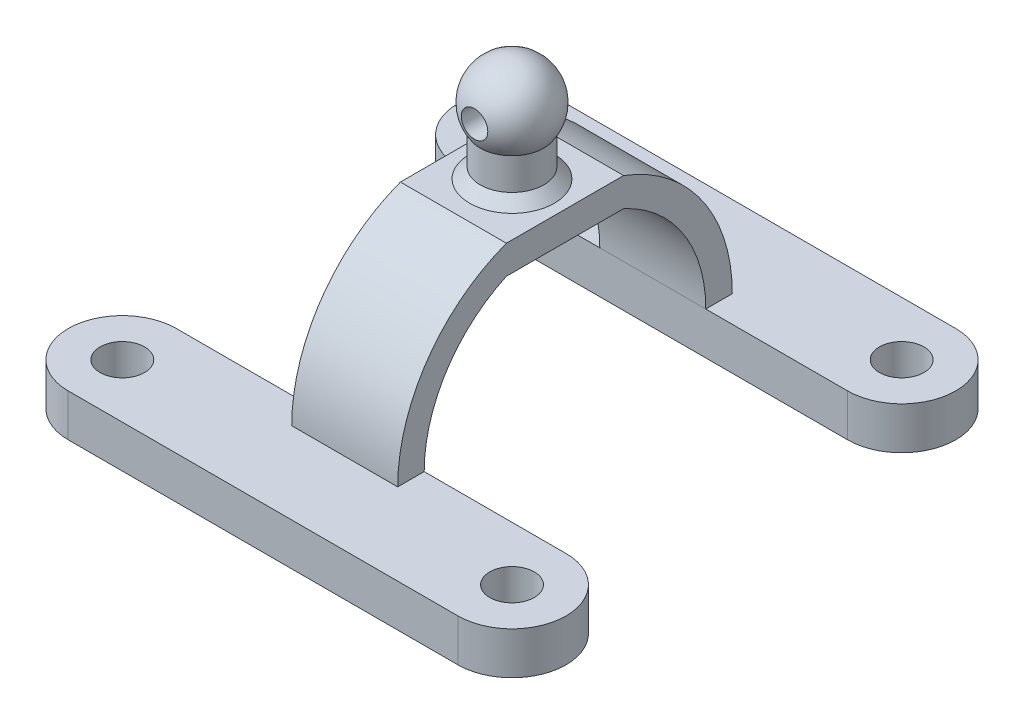
ISO-10303-21;
HEADER;
FILE_DESCRIPTION(('STEP AP214'),'2;1');
FILE_NAME('part.step','',(''),(''),'','','');
FILE_SCHEMA(('AUTOMOTIVE_DESIGN { 1 0 10303 214 1 1 1 1 }'));
ENDSEC;
DATA;
#1=APPLICATION_CONTEXT('core data for automotive mechanical design processes');
#2=APPLICATION_PROTOCOL_DEFINITION('international standard','automotive_design',2000,#1);
#3=PRODUCT_CONTEXT('',#1,'mechanical');
#4=PRODUCT('Part','Part','',(#3));
#5=PRODUCT_RELATED_PRODUCT_CATEGORY('part','',(#4));
#6=PRODUCT_DEFINITION_FORMATION('','',#4);
#7=PRODUCT_DEFINITION_CONTEXT('part definition',#1,'design');
#8=PRODUCT_DEFINITION('design','',#6,#7);
#9=PRODUCT_DEFINITION_SHAPE('','',#8);
#10=(LENGTH_UNIT() NAMED_UNIT(*) SI_UNIT(.MILLI.,.METRE.));
#11=(NAMED_UNIT(*) PLANE_ANGLE_UNIT() SI_UNIT($,.RADIAN.));
#12=(NAMED_UNIT(*) SI_UNIT($,.STERADIAN.) SOLID_ANGLE_UNIT());
#13=UNCERTAINTY_MEASURE_WITH_UNIT(LENGTH_MEASURE(1.E-05),#10,'distance_accuracy_value','');
#14=(GEOMETRIC_REPRESENTATION_CONTEXT(3) GLOBAL_UNCERTAINTY_ASSIGNED_CONTEXT((#13)) GLOBAL_UNIT_ASSIGNED_CONTEXT((#10,
#11,#12)) REPRESENTATION_CONTEXT('',''));
#15=CARTESIAN_POINT('',(0.,0.,0.));
#16=DIRECTION('',(0.,0.,1.));
#17=DIRECTION('',(1.,0.,0.));
#18=AXIS2_PLACEMENT_3D('',#15,#16,#17);
#19=CARTESIAN_POINT('',(-18.385,16.995,-18.385));
#20=DIRECTION('',(0.,1.,0.));
#21=DIRECTION('',(0.,0.,1.));
#22=AXIS2_PLACEMENT_3D('',#19,#20,#21);
#23=PLANE('',#22);
#24=CARTESIAN_POINT('',(-18.385,16.995,-18.385));
#25=DIRECTION('',(0.,1.,0.));
#26=DIRECTION('',(0.,0.,1.));
#27=AXIS2_PLACEMENT_3D('',#24,#25,#26);
#28=CIRCLE('',#27,3.6);
#29=CARTESIAN_POINT('',(-18.385,16.995,-14.785));
#30=VERTEX_POINT('',#29);
#31=EDGE_CURVE('E413',#30,#30,#28,.T.);
#32=ORIENTED_EDGE('',*,*,#31,.F.);
#33=EDGE_LOOP('',(#32));
#34=FACE_BOUND('',#33,.T.);
#35=CARTESIAN_POINT('',(-18.385,16.995,-18.385));
#36=DIRECTION('',(0.,1.,0.));
#37=DIRECTION('',(0.,0.,1.));
#38=AXIS2_PLACEMENT_3D('',#35,#36,#37);
#39=CIRCLE('',#38,2.1);
#40=CARTESIAN_POINT('',(-18.385,16.995,-16.285));
#41=VERTEX_POINT('',#40);
#42=EDGE_CURVE('E399',#41,#41,#39,.T.);
#43=ORIENTED_EDGE('',*,*,#42,.T.);
#44=EDGE_LOOP('',(#43));
#45=FACE_BOUND('',#44,.T.);
#46=ADVANCED_FACE('F49',(#34,#45),#23,.F.);
#47=CARTESIAN_POINT('',(-18.385,17.995,-18.385));
#48=DIRECTION('',(0.,-1.,0.));
#49=DIRECTION('',(0.,0.,-1.));
#50=AXIS2_PLACEMENT_3D('',#47,#48,#49);
#51=CYLINDRICAL_SURFACE('',#50,3.6);
#52=CARTESIAN_POINT('',(-18.385,17.995,-18.385));
#53=DIRECTION('',(0.,1.,0.));
#54=DIRECTION('',(0.,0.,1.));
#55=AXIS2_PLACEMENT_3D('',#52,#53,#54);
#56=CIRCLE('',#55,3.6);
#57=CARTESIAN_POINT('',(-18.385,17.995,-14.785));
#58=VERTEX_POINT('',#57);
#59=EDGE_CURVE('E414',#58,#58,#56,.T.);
#60=ORIENTED_EDGE('',*,*,#59,.F.);
#61=EDGE_LOOP('',(#60));
#62=FACE_BOUND('',#61,.T.);
#63=ORIENTED_EDGE('',*,*,#31,.T.);
#64=EDGE_LOOP('',(#63));
#65=FACE_BOUND('',#64,.T.);
#66=ADVANCED_FACE('F510',(#62,#65),#51,.T.);
#67=CARTESIAN_POINT('',(-18.385,17.995,-18.385));
#68=DIRECTION('',(0.,-1.,0.));
#69=DIRECTION('',(0.,0.,-1.));
#70=AXIS2_PLACEMENT_3D('',#67,#68,#69);
#71=CYLINDRICAL_SURFACE('',#70,2.1);
#72=CARTESIAN_POINT('',(-18.385,21.995,-18.385));
#73=DIRECTION('',(0.,1.,0.));
#74=DIRECTION('',(0.,0.,1.));
#75=AXIS2_PLACEMENT_3D('',#72,#73,#74);
#76=CIRCLE('',#75,2.1);
#77=CARTESIAN_POINT('',(-18.385,21.995,-16.285));
#78=VERTEX_POINT('',#77);
#79=EDGE_CURVE('E377',#78,#78,#76,.T.);
#80=ORIENTED_EDGE('',*,*,#79,.T.);
#81=EDGE_LOOP('',(#80));
#82=FACE_BOUND('',#81,.T.);
#83=ORIENTED_EDGE('',*,*,#42,.F.);
#84=EDGE_LOOP('',(#83));
#85=FACE_BOUND('',#84,.T.);
#86=ADVANCED_FACE('F504',(#82,#85),#71,.F.);
#87=CARTESIAN_POINT('',(0.,17.995,0.));
#88=DIRECTION('',(0.,1.,0.));
#89=DIRECTION('',(0.,0.,1.));
#90=AXIS2_PLACEMENT_3D('',#87,#88,#89);
#91=PLANE('',#90);
#92=DIRECTION('',(1.,0.,0.));
#93=VECTOR('',#92,1.);
#94=CARTESIAN_POINT('',(0.,17.995,-13.285));
#95=LINE('',#94,#93);
#96=CARTESIAN_POINT('',(-18.385,17.995,-13.285));
#97=VERTEX_POINT('',#96);
#98=CARTESIAN_POINT('',(18.385,17.995,-13.285));
#99=VERTEX_POINT('',#98);
#100=EDGE_CURVE('E97',#97,#99,#95,.T.);
#101=ORIENTED_EDGE('',*,*,#100,.F.);
#102=CARTESIAN_POINT('',(-18.385,17.995,-18.385));
#103=DIRECTION('',(0.,1.,0.));
#104=DIRECTION('',(0.,0.,1.));
#105=AXIS2_PLACEMENT_3D('',#102,#103,#104);
#106=CIRCLE('',#105,5.1);
#107=CARTESIAN_POINT('',(-18.385,17.995,-23.485));
#108=VERTEX_POINT('',#107);
#109=EDGE_CURVE('E348',#108,#97,#106,.T.);
#110=ORIENTED_EDGE('',*,*,#109,.F.);
#111=DIRECTION('',(1.,0.,0.));
#112=VECTOR('',#111,1.);
#113=CARTESIAN_POINT('',(0.,17.995,-23.485));
#114=LINE('',#113,#112);
#115=CARTESIAN_POINT('',(18.385,17.995,-23.485));
#116=VERTEX_POINT('',#115);
#117=EDGE_CURVE('E77',#108,#116,#114,.T.);
#118=ORIENTED_EDGE('',*,*,#117,.T.);
#119=CARTESIAN_POINT('',(18.385,17.995,-18.385));
#120=DIRECTION('',(0.,1.,0.));
#121=DIRECTION('',(0.,0.,1.));
#122=AXIS2_PLACEMENT_3D('',#119,#120,#121);
#123=CIRCLE('',#122,5.1);
#124=EDGE_CURVE('E353',#99,#116,#123,.T.);
#125=ORIENTED_EDGE('',*,*,#124,.F.);
#126=EDGE_LOOP('',(#101,#110,#118,#125));
#127=FACE_BOUND('',#126,.T.);
#128=CARTESIAN_POINT('',(18.385,17.995,-18.385));
#129=DIRECTION('',(0.,1.,0.));
#130=DIRECTION('',(0.,0.,1.));
#131=AXIS2_PLACEMENT_3D('',#128,#129,#130);
#132=CIRCLE('',#131,3.6);
#133=CARTESIAN_POINT('',(18.385,17.995,-14.785));
#134=VERTEX_POINT('',#133);
#135=EDGE_CURVE('E373',#134,#134,#132,.T.);
#136=ORIENTED_EDGE('',*,*,#135,.T.);
#137=EDGE_LOOP('',(#136));
#138=FACE_BOUND('',#137,.T.);
#139=ORIENTED_EDGE('',*,*,#59,.T.);
#140=EDGE_LOOP('',(#139));
#141=FACE_BOUND('',#140,.T.);
#142=ADVANCED_FACE('F501',(#127,#138,#141),#91,.F.);
#143=CARTESIAN_POINT('',(0.,17.995,-23.485));
#144=DIRECTION('',(0.,0.,1.));
#145=DIRECTION('',(0.,-1.,0.));
#146=AXIS2_PLACEMENT_3D('',#143,#144,#145);
#147=PLANE('',#146);
#148=DIRECTION('',(1.,0.,0.));
#149=VECTOR('',#148,1.);
#150=CARTESIAN_POINT('',(0.,21.995,-23.485));
#151=LINE('',#150,#149);
#152=CARTESIAN_POINT('',(-18.385,21.995,-23.485));
#153=VERTEX_POINT('',#152);
#154=CARTESIAN_POINT('',(18.385,21.995,-23.485));
#155=VERTEX_POINT('',#154);
#156=EDGE_CURVE('E383',#153,#155,#151,.T.);
#157=ORIENTED_EDGE('',*,*,#156,.T.);
#158=DIRECTION('',(0.,1.,0.));
#159=VECTOR('',#158,1.);
#160=CARTESIAN_POINT('',(18.385,17.995,-23.485));
#161=LINE('',#160,#159);
#162=EDGE_CURVE('E400',#116,#155,#161,.T.);
#163=ORIENTED_EDGE('',*,*,#162,.F.);
#164=ORIENTED_EDGE('',*,*,#117,.F.);
#165=DIRECTION('',(0.,1.,0.));
#166=VECTOR('',#165,1.);
#167=CARTESIAN_POINT('',(-18.385,17.995,-23.485));
#168=LINE('',#167,#166);
#169=EDGE_CURVE('E90',#108,#153,#168,.T.);
#170=ORIENTED_EDGE('',*,*,#169,.T.);
#171=EDGE_LOOP('',(#157,#163,#164,#170));
#172=FACE_BOUND('',#171,.T.);
#173=ADVANCED_FACE('F495',(#172),#147,.F.);
#174=CARTESIAN_POINT('',(0.,17.995,-13.285));
#175=DIRECTION('',(0.,0.,1.));
#176=DIRECTION('',(0.,-1.,0.));
#177=AXIS2_PLACEMENT_3D('',#174,#175,#176);
#178=PLANE('',#177);
#179=DIRECTION('',(1.,0.,0.));
#180=VECTOR('',#179,1.);
#181=CARTESIAN_POINT('',(0.,21.995,-13.285));
#182=LINE('',#181,#180);
#183=CARTESIAN_POINT('',(-18.385,21.995,-13.285));
#184=VERTEX_POINT('',#183);
#185=CARTESIAN_POINT('',(-5.,21.995,-13.285));
#186=VERTEX_POINT('',#185);
#187=EDGE_CURVE('E391',#184,#186,#182,.T.);
#188=ORIENTED_EDGE('',*,*,#187,.F.);
#189=DIRECTION('',(0.,1.,0.));
#190=VECTOR('',#189,1.);
#191=CARTESIAN_POINT('',(-18.385,17.995,-13.285));
#192=LINE('',#191,#190);
#193=EDGE_CURVE('E386',#97,#184,#192,.T.);
#194=ORIENTED_EDGE('',*,*,#193,.F.);
#195=ORIENTED_EDGE('',*,*,#100,.T.);
#196=DIRECTION('',(0.,1.,0.));
#197=VECTOR('',#196,1.);
#198=CARTESIAN_POINT('',(18.385,17.995,-13.285));
#199=LINE('',#198,#197);
#200=CARTESIAN_POINT('',(18.385,21.995,-13.285));
#201=VERTEX_POINT('',#200);
#202=EDGE_CURVE('E404',#99,#201,#199,.T.);
#203=ORIENTED_EDGE('',*,*,#202,.T.);
#204=CARTESIAN_POINT('',(5.,21.995,-13.285));
#205=VERTEX_POINT('',#204);
#206=EDGE_CURVE('E390',#205,#201,#182,.T.);
#207=ORIENTED_EDGE('',*,*,#206,.F.);
#208=DIRECTION('',(-1.,0.,0.));
#209=VECTOR('',#208,1.);
#210=CARTESIAN_POINT('',(5.,21.995,-13.285));
#211=LINE('',#210,#209);
#212=EDGE_CURVE('E329',#205,#186,#211,.T.);
#213=ORIENTED_EDGE('',*,*,#212,.T.);
#214=EDGE_LOOP('',(#188,#194,#195,#203,#207,#213));
#215=FACE_BOUND('',#214,.T.);
#216=ADVANCED_FACE('F468',(#215),#178,.T.);
#217=CARTESIAN_POINT('',(0.,21.995,0.));
#218=DIRECTION('',(0.,1.,0.));
#219=DIRECTION('',(0.,0.,1.));
#220=AXIS2_PLACEMENT_3D('',#217,#218,#219);
#221=PLANE('',#220);
#222=DIRECTION('',(0.,0.,1.));
#223=VECTOR('',#222,1.);
#224=CARTESIAN_POINT('',(5.,21.995,0.));
#225=LINE('',#224,#223);
#226=CARTESIAN_POINT('',(5.,21.995,-15.785));
#227=VERTEX_POINT('',#226);
#228=EDGE_CURVE('E285',#227,#205,#225,.T.);
#229=ORIENTED_EDGE('',*,*,#228,.T.);
#230=ORIENTED_EDGE('',*,*,#206,.T.);
#231=CARTESIAN_POINT('',(18.385,21.995,-18.385));
#232=DIRECTION('',(0.,1.,0.));
#233=DIRECTION('',(0.,0.,1.));
#234=AXIS2_PLACEMENT_3D('',#231,#232,#233);
#235=CIRCLE('',#234,5.1);
#236=EDGE_CURVE('E361',#201,#155,#235,.T.);
#237=ORIENTED_EDGE('',*,*,#236,.T.);
#238=ORIENTED_EDGE('',*,*,#156,.F.);
#239=CARTESIAN_POINT('',(-18.385,21.995,-18.385));
#240=DIRECTION('',(0.,1.,0.));
#241=DIRECTION('',(0.,0.,1.));
#242=AXIS2_PLACEMENT_3D('',#239,#240,#241);
#243=CIRCLE('',#242,5.1);
#244=EDGE_CURVE('E349',#153,#184,#243,.T.);
#245=ORIENTED_EDGE('',*,*,#244,.T.);
#246=ORIENTED_EDGE('',*,*,#187,.T.);
#247=DIRECTION('',(0.,0.,1.));
#248=VECTOR('',#247,1.);
#249=CARTESIAN_POINT('',(-5.,21.995,0.));
#250=LINE('',#249,#248);
#251=CARTESIAN_POINT('',(-5.,21.995,-15.785));
#252=VERTEX_POINT('',#251);
#253=EDGE_CURVE('E314',#252,#186,#250,.T.);
#254=ORIENTED_EDGE('',*,*,#253,.F.);
#255=DIRECTION('',(-1.,0.,0.));
#256=VECTOR('',#255,1.);
#257=CARTESIAN_POINT('',(5.,21.995,-15.785));
#258=LINE('',#257,#256);
#259=EDGE_CURVE('E326',#227,#252,#258,.T.);
#260=ORIENTED_EDGE('',*,*,#259,.F.);
#261=EDGE_LOOP('',(#229,#230,#237,#238,#245,#246,#254,#260));
#262=FACE_BOUND('',#261,.T.);
#263=ORIENTED_EDGE('',*,*,#79,.F.);
#264=EDGE_LOOP('',(#263));
#265=FACE_BOUND('',#264,.T.);
#266=CARTESIAN_POINT('',(18.385,21.995,-18.385));
#267=DIRECTION('',(0.,1.,0.));
#268=DIRECTION('',(0.,0.,1.));
#269=AXIS2_PLACEMENT_3D('',#266,#267,#268);
#270=CIRCLE('',#269,2.1);
#271=CARTESIAN_POINT('',(18.385,21.995,-16.285));
#272=VERTEX_POINT('',#271);
#273=EDGE_CURVE('E357',#272,#272,#270,.T.);
#274=ORIENTED_EDGE('',*,*,#273,.F.);
#275=EDGE_LOOP('',(#274));
#276=FACE_BOUND('',#275,.T.);
#277=ADVANCED_FACE('F462',(#262,#265,#276),#221,.T.);
#278=CARTESIAN_POINT('',(18.385,21.995,-18.385));
#279=DIRECTION('',(0.,-1.,0.));
#280=DIRECTION('',(0.,0.,-1.));
#281=AXIS2_PLACEMENT_3D('',#278,#279,#280);
#282=CYLINDRICAL_SURFACE('',#281,5.1);
#283=ORIENTED_EDGE('',*,*,#124,.T.);
#284=ORIENTED_EDGE('',*,*,#162,.T.);
#285=ORIENTED_EDGE('',*,*,#236,.F.);
#286=ORIENTED_EDGE('',*,*,#202,.F.);
#287=EDGE_LOOP('',(#283,#284,#285,#286));
#288=FACE_BOUND('',#287,.T.);
#289=ADVANCED_FACE('F494',(#288),#282,.T.);
#290=CARTESIAN_POINT('',(18.385,16.995,-18.385));
#291=DIRECTION('',(0.,1.,0.));
#292=DIRECTION('',(0.,0.,1.));
#293=AXIS2_PLACEMENT_3D('',#290,#291,#292);
#294=PLANE('',#293);
#295=CARTESIAN_POINT('',(18.385,16.995,-18.385));
#296=DIRECTION('',(0.,1.,0.));
#297=DIRECTION('',(0.,0.,1.));
#298=AXIS2_PLACEMENT_3D('',#295,#296,#297);
#299=CIRCLE('',#298,3.6);
#300=CARTESIAN_POINT('',(18.385,16.995,-14.785));
#301=VERTEX_POINT('',#300);
#302=EDGE_CURVE('E372',#301,#301,#299,.T.);
#303=ORIENTED_EDGE('',*,*,#302,.F.);
#304=EDGE_LOOP('',(#303));
#305=FACE_BOUND('',#304,.T.);
#306=CARTESIAN_POINT('',(18.385,16.995,-18.385));
#307=DIRECTION('',(0.,1.,0.));
#308=DIRECTION('',(0.,0.,1.));
#309=AXIS2_PLACEMENT_3D('',#306,#307,#308);
#310=CIRCLE('',#309,2.1);
#311=CARTESIAN_POINT('',(18.385,16.995,-16.285));
#312=VERTEX_POINT('',#311);
#313=EDGE_CURVE('E365',#312,#312,#310,.T.);
#314=ORIENTED_EDGE('',*,*,#313,.T.);
#315=EDGE_LOOP('',(#314));
#316=FACE_BOUND('',#315,.T.);
#317=ADVANCED_FACE('F536',(#305,#316),#294,.F.);
#318=CARTESIAN_POINT('',(18.385,17.995,-18.385));
#319=DIRECTION('',(0.,-1.,0.));
#320=DIRECTION('',(0.,0.,-1.));
#321=AXIS2_PLACEMENT_3D('',#318,#319,#320);
#322=CYLINDRICAL_SURFACE('',#321,3.6);
#323=ORIENTED_EDGE('',*,*,#135,.F.);
#324=EDGE_LOOP('',(#323));
#325=FACE_BOUND('',#324,.T.);
#326=ORIENTED_EDGE('',*,*,#302,.T.);
#327=EDGE_LOOP('',(#326));
#328=FACE_BOUND('',#327,.T.);
#329=ADVANCED_FACE('F532',(#325,#328),#322,.T.);
#330=CARTESIAN_POINT('',(18.385,17.995,-18.385));
#331=DIRECTION('',(0.,-1.,0.));
#332=DIRECTION('',(0.,0.,-1.));
#333=AXIS2_PLACEMENT_3D('',#330,#331,#332);
#334=CYLINDRICAL_SURFACE('',#333,2.1);
#335=ORIENTED_EDGE('',*,*,#313,.F.);
#336=EDGE_LOOP('',(#335));
#337=FACE_BOUND('',#336,.T.);
#338=ORIENTED_EDGE('',*,*,#273,.T.);
#339=EDGE_LOOP('',(#338));
#340=FACE_BOUND('',#339,.T.);
#341=ADVANCED_FACE('F535',(#337,#340),#334,.F.);
#342=CARTESIAN_POINT('',(-18.385,21.995,-18.385));
#343=DIRECTION('',(0.,-1.,0.));
#344=DIRECTION('',(0.,0.,-1.));
#345=AXIS2_PLACEMENT_3D('',#342,#343,#344);
#346=CYLINDRICAL_SURFACE('',#345,5.1);
#347=ORIENTED_EDGE('',*,*,#169,.F.);
#348=ORIENTED_EDGE('',*,*,#109,.T.);
#349=ORIENTED_EDGE('',*,*,#193,.T.);
#350=ORIENTED_EDGE('',*,*,#244,.F.);
#351=EDGE_LOOP('',(#347,#348,#349,#350));
#352=FACE_BOUND('',#351,.T.);
#353=ADVANCED_FACE('F498',(#352),#346,.T.);
#354=CARTESIAN_POINT('',(5.,21.995,0.));
#355=DIRECTION('',(-1.,0.,0.));
#356=DIRECTION('',(0.,0.,1.));
#357=AXIS2_PLACEMENT_3D('',#354,#355,#356);
#358=CYLINDRICAL_SURFACE('',#357,15.785);
#359=CARTESIAN_POINT('',(-5.,21.995,0.));
#360=DIRECTION('',(1.,0.,0.));
#361=DIRECTION('',(0.,0.,-1.));
#362=AXIS2_PLACEMENT_3D('',#359,#360,#361);
#363=CIRCLE('',#362,15.785);
#364=CARTESIAN_POINT('',(-5.,21.995,15.785));
#365=VERTEX_POINT('',#364);
#366=CARTESIAN_POINT('',(-5.,36.78,5.52901437871162));
#367=VERTEX_POINT('',#366);
#368=EDGE_CURVE('E264',#365,#367,#363,.F.);
#369=ORIENTED_EDGE('',*,*,#368,.F.);
#370=DIRECTION('',(-1.,0.,0.));
#371=VECTOR('',#370,1.);
#372=CARTESIAN_POINT('',(5.,21.995,15.785));
#373=LINE('',#372,#371);
#374=CARTESIAN_POINT('',(5.,21.995,15.785));
#375=VERTEX_POINT('',#374);
#376=EDGE_CURVE('E345',#375,#365,#373,.T.);
#377=ORIENTED_EDGE('',*,*,#376,.F.);
#378=CARTESIAN_POINT('',(5.,21.995,0.));
#379=DIRECTION('',(1.,0.,0.));
#380=DIRECTION('',(0.,0.,-1.));
#381=AXIS2_PLACEMENT_3D('',#378,#379,#380);
#382=CIRCLE('',#381,15.785);
#383=CARTESIAN_POINT('',(5.,36.78,5.52901437871162));
#384=VERTEX_POINT('',#383);
#385=EDGE_CURVE('E268',#375,#384,#382,.F.);
#386=ORIENTED_EDGE('',*,*,#385,.T.);
#387=DIRECTION('',(-1.,0.,0.));
#388=VECTOR('',#387,1.);
#389=CARTESIAN_POINT('',(5.,36.78,5.52901437871162));
#390=LINE('',#389,#388);
#391=EDGE_CURVE('E297',#384,#367,#390,.T.);
#392=ORIENTED_EDGE('',*,*,#391,.T.);
#393=EDGE_LOOP('',(#369,#377,#386,#392));
#394=FACE_BOUND('',#393,.T.);
#395=ADVANCED_FACE('F452',(#394),#358,.T.);
#396=CARTESIAN_POINT('',(5.,21.995,0.));
#397=DIRECTION('',(-1.,0.,0.));
#398=DIRECTION('',(0.,0.,1.));
#399=AXIS2_PLACEMENT_3D('',#396,#397,#398);
#400=CYLINDRICAL_SURFACE('',#399,13.285);
#401=CARTESIAN_POINT('',(-5.,21.995,0.));
#402=DIRECTION('',(1.,0.,0.));
#403=DIRECTION('',(0.,0.,-1.));
#404=AXIS2_PLACEMENT_3D('',#401,#402,#403);
#405=CIRCLE('',#404,13.285);
#406=CARTESIAN_POINT('',(-5.,21.995,13.285));
#407=VERTEX_POINT('',#406);
#408=CARTESIAN_POINT('',(-5.,34.0747858010811,5.52901437871162));
#409=VERTEX_POINT('',#408);
#410=EDGE_CURVE('E305',#407,#409,#405,.F.);
#411=ORIENTED_EDGE('',*,*,#410,.T.);
#412=DIRECTION('',(-1.,0.,0.));
#413=VECTOR('',#412,1.);
#414=CARTESIAN_POINT('',(5.,34.0747858010811,5.52901437871162));
#415=LINE('',#414,#413);
#416=CARTESIAN_POINT('',(5.,34.0747858010811,5.52901437871162));
#417=VERTEX_POINT('',#416);
#418=EDGE_CURVE('E337',#417,#409,#415,.T.);
#419=ORIENTED_EDGE('',*,*,#418,.F.);
#420=CARTESIAN_POINT('',(5.,21.995,0.));
#421=DIRECTION('',(1.,0.,0.));
#422=DIRECTION('',(0.,0.,-1.));
#423=AXIS2_PLACEMENT_3D('',#420,#421,#422);
#424=CIRCLE('',#423,13.285);
#425=CARTESIAN_POINT('',(5.,21.995,13.285));
#426=VERTEX_POINT('',#425);
#427=EDGE_CURVE('E276',#426,#417,#424,.F.);
#428=ORIENTED_EDGE('',*,*,#427,.F.);
#429=DIRECTION('',(-1.,0.,0.));
#430=VECTOR('',#429,1.);
#431=CARTESIAN_POINT('',(5.,21.995,13.285));
#432=LINE('',#431,#430);
#433=EDGE_CURVE('E341',#426,#407,#432,.T.);
#434=ORIENTED_EDGE('',*,*,#433,.T.);
#435=EDGE_LOOP('',(#411,#419,#428,#434));
#436=FACE_BOUND('',#435,.T.);
#437=ADVANCED_FACE('F478',(#436),#400,.F.);
#438=CARTESIAN_POINT('',(5.,34.0747858010811,0.));
#439=DIRECTION('',(0.,1.,0.));
#440=DIRECTION('',(0.,0.,1.));
#441=AXIS2_PLACEMENT_3D('',#438,#439,#440);
#442=PLANE('',#441);
#443=DIRECTION('',(0.,0.,-1.));
#444=VECTOR('',#443,1.);
#445=CARTESIAN_POINT('',(-5.,34.0747858010811,0.));
#446=LINE('',#445,#444);
#447=CARTESIAN_POINT('',(-5.,34.0747858010811,-5.52901437871162));
#448=VERTEX_POINT('',#447);
#449=EDGE_CURVE('E308',#409,#448,#446,.T.);
#450=ORIENTED_EDGE('',*,*,#449,.T.);
#451=DIRECTION('',(-1.,0.,0.));
#452=VECTOR('',#451,1.);
#453=CARTESIAN_POINT('',(5.,34.0747858010811,-5.52901437871162));
#454=LINE('',#453,#452);
#455=CARTESIAN_POINT('',(5.,34.0747858010811,-5.52901437871162));
#456=VERTEX_POINT('',#455);
#457=EDGE_CURVE('E333',#456,#448,#454,.T.);
#458=ORIENTED_EDGE('',*,*,#457,.F.);
#459=DIRECTION('',(0.,0.,-1.));
#460=VECTOR('',#459,1.);
#461=CARTESIAN_POINT('',(5.,34.0747858010811,0.));
#462=LINE('',#461,#460);
#463=EDGE_CURVE('E279',#417,#456,#462,.T.);
#464=ORIENTED_EDGE('',*,*,#463,.F.);
#465=ORIENTED_EDGE('',*,*,#418,.T.);
#466=EDGE_LOOP('',(#450,#458,#464,#465));
#467=FACE_BOUND('',#466,.T.);
#468=ADVANCED_FACE('F475',(#467),#442,.F.);
#469=CARTESIAN_POINT('',(5.,21.995,0.));
#470=DIRECTION('',(-1.,0.,0.));
#471=DIRECTION('',(0.,0.,1.));
#472=AXIS2_PLACEMENT_3D('',#469,#470,#471);
#473=CYLINDRICAL_SURFACE('',#472,13.285);
#474=CARTESIAN_POINT('',(-5.,21.995,0.));
#475=DIRECTION('',(1.,0.,0.));
#476=DIRECTION('',(0.,0.,-1.));
#477=AXIS2_PLACEMENT_3D('',#474,#475,#476);
#478=CIRCLE('',#477,13.285);
#479=EDGE_CURVE('E311',#448,#186,#478,.F.);
#480=ORIENTED_EDGE('',*,*,#479,.T.);
#481=ORIENTED_EDGE('',*,*,#212,.F.);
#482=CARTESIAN_POINT('',(5.,21.995,0.));
#483=DIRECTION('',(1.,0.,0.));
#484=DIRECTION('',(0.,0.,-1.));
#485=AXIS2_PLACEMENT_3D('',#482,#483,#484);
#486=CIRCLE('',#485,13.285);
#487=EDGE_CURVE('E282',#456,#205,#486,.F.);
#488=ORIENTED_EDGE('',*,*,#487,.F.);
#489=ORIENTED_EDGE('',*,*,#457,.T.);
#490=EDGE_LOOP('',(#480,#481,#488,#489));
#491=FACE_BOUND('',#490,.T.);
#492=ADVANCED_FACE('F471',(#491),#473,.F.);
#493=CARTESIAN_POINT('',(5.,21.995,0.));
#494=DIRECTION('',(-1.,0.,0.));
#495=DIRECTION('',(0.,0.,1.));
#496=AXIS2_PLACEMENT_3D('',#493,#494,#495);
#497=CYLINDRICAL_SURFACE('',#496,15.785);
#498=CARTESIAN_POINT('',(-5.,21.995,0.));
#499=DIRECTION('',(1.,0.,0.));
#500=DIRECTION('',(0.,0.,-1.));
#501=AXIS2_PLACEMENT_3D('',#498,#499,#500);
#502=CIRCLE('',#501,15.785);
#503=CARTESIAN_POINT('',(-5.,36.78,-5.52901437871162));
#504=VERTEX_POINT('',#503);
#505=EDGE_CURVE('E68',#504,#252,#502,.F.);
#506=ORIENTED_EDGE('',*,*,#505,.F.);
#507=DIRECTION('',(-1.,0.,0.));
#508=VECTOR('',#507,1.);
#509=CARTESIAN_POINT('',(5.,36.78,-5.52901437871162));
#510=LINE('',#509,#508);
#511=CARTESIAN_POINT('',(5.,36.78,-5.52901437871162));
#512=VERTEX_POINT('',#511);
#513=EDGE_CURVE('E323',#512,#504,#510,.T.);
#514=ORIENTED_EDGE('',*,*,#513,.F.);
#515=CARTESIAN_POINT('',(5.,21.995,0.));
#516=DIRECTION('',(1.,0.,0.));
#517=DIRECTION('',(0.,0.,-1.));
#518=AXIS2_PLACEMENT_3D('',#515,#516,#517);
#519=CIRCLE('',#518,15.785);
#520=EDGE_CURVE('E289',#512,#227,#519,.F.);
#521=ORIENTED_EDGE('',*,*,#520,.T.);
#522=ORIENTED_EDGE('',*,*,#259,.T.);
#523=EDGE_LOOP('',(#506,#514,#521,#522));
#524=FACE_BOUND('',#523,.T.);
#525=ADVANCED_FACE('F444',(#524),#497,.T.);
#526=CARTESIAN_POINT('',(5.,36.78,0.));
#527=DIRECTION('',(0.,1.,0.));
#528=DIRECTION('',(0.,0.,1.));
#529=AXIS2_PLACEMENT_3D('',#526,#527,#528);
#530=PLANE('',#529);
#531=CARTESIAN_POINT('',(0.,36.78,0.));
#532=DIRECTION('',(0.,1.,0.));
#533=DIRECTION('',(0.,0.,1.));
#534=AXIS2_PLACEMENT_3D('',#531,#532,#533);
#535=CIRCLE('',#534,4.);
#536=CARTESIAN_POINT('',(0.,36.78,4.));
#537=VERTEX_POINT('',#536);
#538=EDGE_CURVE('E60',#537,#537,#535,.T.);
#539=ORIENTED_EDGE('',*,*,#538,.F.);
#540=EDGE_LOOP('',(#539));
#541=FACE_BOUND('',#540,.T.);
#542=DIRECTION('',(0.,0.,-1.));
#543=VECTOR('',#542,1.);
#544=CARTESIAN_POINT('',(-5.,36.78,0.));
#545=LINE('',#544,#543);
#546=EDGE_CURVE('E273',#367,#504,#545,.T.);
#547=ORIENTED_EDGE('',*,*,#546,.F.);
#548=ORIENTED_EDGE('',*,*,#391,.F.);
#549=DIRECTION('',(0.,0.,-1.));
#550=VECTOR('',#549,1.);
#551=CARTESIAN_POINT('',(5.,36.78,0.));
#552=LINE('',#551,#550);
#553=EDGE_CURVE('E293',#384,#512,#552,.T.);
#554=ORIENTED_EDGE('',*,*,#553,.T.);
#555=ORIENTED_EDGE('',*,*,#513,.T.);
#556=EDGE_LOOP('',(#547,#548,#554,#555));
#557=FACE_BOUND('',#556,.T.);
#558=ADVANCED_FACE('F440',(#541,#557),#530,.T.);
#559=CARTESIAN_POINT('',(5.,0.,0.));
#560=DIRECTION('',(1.,0.,0.));
#561=DIRECTION('',(0.,0.,-1.));
#562=AXIS2_PLACEMENT_3D('',#559,#560,#561);
#563=PLANE('',#562);
#564=ORIENTED_EDGE('',*,*,#385,.F.);
#565=DIRECTION('',(0.,0.,1.));
#566=VECTOR('',#565,1.);
#567=CARTESIAN_POINT('',(5.,21.995,0.));
#568=LINE('',#567,#566);
#569=EDGE_CURVE('E272',#426,#375,#568,.T.);
#570=ORIENTED_EDGE('',*,*,#569,.F.);
#571=ORIENTED_EDGE('',*,*,#427,.T.);
#572=ORIENTED_EDGE('',*,*,#463,.T.);
#573=ORIENTED_EDGE('',*,*,#487,.T.);
#574=ORIENTED_EDGE('',*,*,#228,.F.);
#575=ORIENTED_EDGE('',*,*,#520,.F.);
#576=ORIENTED_EDGE('',*,*,#553,.F.);
#577=EDGE_LOOP('',(#564,#570,#571,#572,#573,#574,#575,#576));
#578=FACE_BOUND('',#577,.T.);
#579=ADVANCED_FACE('F443',(#578),#563,.T.);
#580=CARTESIAN_POINT('',(-5.,0.,0.));
#581=DIRECTION('',(1.,0.,0.));
#582=DIRECTION('',(0.,0.,-1.));
#583=AXIS2_PLACEMENT_3D('',#580,#581,#582);
#584=PLANE('',#583);
#585=ORIENTED_EDGE('',*,*,#368,.T.);
#586=ORIENTED_EDGE('',*,*,#546,.T.);
#587=ORIENTED_EDGE('',*,*,#505,.T.);
#588=ORIENTED_EDGE('',*,*,#253,.T.);
#589=ORIENTED_EDGE('',*,*,#479,.F.);
#590=ORIENTED_EDGE('',*,*,#449,.F.);
#591=ORIENTED_EDGE('',*,*,#410,.F.);
#592=DIRECTION('',(0.,0.,1.));
#593=VECTOR('',#592,1.);
#594=CARTESIAN_POINT('',(-5.,21.995,0.));
#595=LINE('',#594,#593);
#596=EDGE_CURVE('E301',#407,#365,#595,.T.);
#597=ORIENTED_EDGE('',*,*,#596,.T.);
#598=EDGE_LOOP('',(#585,#586,#587,#588,#589,#590,#591,#597));
#599=FACE_BOUND('',#598,.T.);
#600=ADVANCED_FACE('F447',(#599),#584,.F.);
#601=CARTESIAN_POINT('',(18.385,21.995,18.385));
#602=DIRECTION('',(0.,-1.,0.));
#603=DIRECTION('',(0.,0.,-1.));
#604=AXIS2_PLACEMENT_3D('',#601,#602,#603);
#605=CYLINDRICAL_SURFACE('',#604,5.1);
#606=DIRECTION('',(0.,1.,0.));
#607=VECTOR('',#606,1.);
#608=CARTESIAN_POINT('',(18.385,17.995,13.285));
#609=LINE('',#608,#607);
#610=CARTESIAN_POINT('',(18.385,17.995,13.285));
#611=VERTEX_POINT('',#610);
#612=CARTESIAN_POINT('',(18.385,21.995,13.285));
#613=VERTEX_POINT('',#612);
#614=EDGE_CURVE('E240',#611,#613,#609,.T.);
#615=ORIENTED_EDGE('',*,*,#614,.T.);
#616=CARTESIAN_POINT('',(18.385,21.995,18.385));
#617=DIRECTION('',(0.,1.,0.));
#618=DIRECTION('',(0.,0.,1.));
#619=AXIS2_PLACEMENT_3D('',#616,#617,#618);
#620=CIRCLE('',#619,5.1);
#621=CARTESIAN_POINT('',(18.385,21.995,23.485));
#622=VERTEX_POINT('',#621);
#623=EDGE_CURVE('E250',#622,#613,#620,.T.);
#624=ORIENTED_EDGE('',*,*,#623,.F.);
#625=DIRECTION('',(0.,1.,0.));
#626=VECTOR('',#625,1.);
#627=CARTESIAN_POINT('',(18.385,17.995,23.485));
#628=LINE('',#627,#626);
#629=CARTESIAN_POINT('',(18.385,17.995,23.485));
#630=VERTEX_POINT('',#629);
#631=EDGE_CURVE('E182',#630,#622,#628,.T.);
#632=ORIENTED_EDGE('',*,*,#631,.F.);
#633=CARTESIAN_POINT('',(18.385,17.995,18.385));
#634=DIRECTION('',(0.,1.,0.));
#635=DIRECTION('',(0.,0.,1.));
#636=AXIS2_PLACEMENT_3D('',#633,#634,#635);
#637=CIRCLE('',#636,5.1);
#638=EDGE_CURVE('E239',#630,#611,#637,.T.);
#639=ORIENTED_EDGE('',*,*,#638,.T.);
#640=EDGE_LOOP('',(#615,#624,#632,#639));
#641=FACE_BOUND('',#640,.T.);
#642=ADVANCED_FACE('F488',(#641),#605,.T.);
#643=CARTESIAN_POINT('',(18.385,16.995,18.385));
#644=DIRECTION('',(0.,1.,0.));
#645=DIRECTION('',(0.,0.,1.));
#646=AXIS2_PLACEMENT_3D('',#643,#644,#645);
#647=PLANE('',#646);
#648=CARTESIAN_POINT('',(18.385,16.995,18.385));
#649=DIRECTION('',(0.,1.,0.));
#650=DIRECTION('',(0.,0.,1.));
#651=AXIS2_PLACEMENT_3D('',#648,#649,#650);
#652=CIRCLE('',#651,3.6);
#653=CARTESIAN_POINT('',(18.385,16.995,21.985));
#654=VERTEX_POINT('',#653);
#655=EDGE_CURVE('E259',#654,#654,#652,.T.);
#656=ORIENTED_EDGE('',*,*,#655,.F.);
#657=EDGE_LOOP('',(#656));
#658=FACE_BOUND('',#657,.T.);
#659=CARTESIAN_POINT('',(18.385,16.995,18.385));
#660=DIRECTION('',(0.,1.,0.));
#661=DIRECTION('',(0.,0.,1.));
#662=AXIS2_PLACEMENT_3D('',#659,#660,#661);
#663=CIRCLE('',#662,2.1);
#664=CARTESIAN_POINT('',(18.385,16.995,20.485));
#665=VERTEX_POINT('',#664);
#666=EDGE_CURVE('E253',#665,#665,#663,.T.);
#667=ORIENTED_EDGE('',*,*,#666,.T.);
#668=EDGE_LOOP('',(#667));
#669=FACE_BOUND('',#668,.T.);
#670=ADVANCED_FACE('F566',(#658,#669),#647,.F.);
#671=CARTESIAN_POINT('',(18.385,17.995,18.385));
#672=DIRECTION('',(0.,-1.,0.));
#673=DIRECTION('',(0.,0.,-1.));
#674=AXIS2_PLACEMENT_3D('',#671,#672,#673);
#675=CYLINDRICAL_SURFACE('',#674,3.6);
#676=CARTESIAN_POINT('',(18.385,17.995,18.385));
#677=DIRECTION('',(0.,1.,0.));
#678=DIRECTION('',(0.,0.,1.));
#679=AXIS2_PLACEMENT_3D('',#676,#677,#678);
#680=CIRCLE('',#679,3.6);
#681=CARTESIAN_POINT('',(18.385,17.995,21.985));
#682=VERTEX_POINT('',#681);
#683=EDGE_CURVE('E260',#682,#682,#680,.T.);
#684=ORIENTED_EDGE('',*,*,#683,.F.);
#685=EDGE_LOOP('',(#684));
#686=FACE_BOUND('',#685,.T.);
#687=ORIENTED_EDGE('',*,*,#655,.T.);
#688=EDGE_LOOP('',(#687));
#689=FACE_BOUND('',#688,.T.);
#690=ADVANCED_FACE('F562',(#686,#689),#675,.T.);
#691=CARTESIAN_POINT('',(18.385,17.995,18.385));
#692=DIRECTION('',(0.,-1.,0.));
#693=DIRECTION('',(0.,0.,-1.));
#694=AXIS2_PLACEMENT_3D('',#691,#692,#693);
#695=CYLINDRICAL_SURFACE('',#694,2.1);
#696=ORIENTED_EDGE('',*,*,#666,.F.);
#697=EDGE_LOOP('',(#696));
#698=FACE_BOUND('',#697,.T.);
#699=CARTESIAN_POINT('',(18.385,21.995,18.385));
#700=DIRECTION('',(0.,1.,0.));
#701=DIRECTION('',(0.,0.,1.));
#702=AXIS2_PLACEMENT_3D('',#699,#700,#701);
#703=CIRCLE('',#702,2.1);
#704=CARTESIAN_POINT('',(18.385,21.995,20.485));
#705=VERTEX_POINT('',#704);
#706=EDGE_CURVE('E246',#705,#705,#703,.F.);
#707=ORIENTED_EDGE('',*,*,#706,.F.);
#708=EDGE_LOOP('',(#707));
#709=FACE_BOUND('',#708,.T.);
#710=ADVANCED_FACE('F565',(#698,#709),#695,.F.);
#711=CARTESIAN_POINT('',(0.,21.995,0.));
#712=DIRECTION('',(0.,1.,0.));
#713=DIRECTION('',(0.,0.,1.));
#714=AXIS2_PLACEMENT_3D('',#711,#712,#713);
#715=PLANE('',#714);
#716=ORIENTED_EDGE('',*,*,#706,.T.);
#717=EDGE_LOOP('',(#716));
#718=FACE_BOUND('',#717,.T.);
#719=DIRECTION('',(1.,0.,0.));
#720=VECTOR('',#719,1.);
#721=CARTESIAN_POINT('',(0.,21.995,13.285));
#722=LINE('',#721,#720);
#723=EDGE_CURVE('E187',#426,#613,#722,.T.);
#724=ORIENTED_EDGE('',*,*,#723,.F.);
#725=ORIENTED_EDGE('',*,*,#569,.T.);
#726=ORIENTED_EDGE('',*,*,#376,.T.);
#727=ORIENTED_EDGE('',*,*,#596,.F.);
#728=CARTESIAN_POINT('',(-18.385,21.995,13.285));
#729=VERTEX_POINT('',#728);
#730=EDGE_CURVE('E204',#729,#407,#722,.T.);
#731=ORIENTED_EDGE('',*,*,#730,.F.);
#732=CARTESIAN_POINT('',(-18.385,21.995,18.385));
#733=DIRECTION('',(0.,1.,0.));
#734=DIRECTION('',(0.,0.,1.));
#735=AXIS2_PLACEMENT_3D('',#732,#733,#734);
#736=CIRCLE('',#735,5.1);
#737=CARTESIAN_POINT('',(-18.385,21.995,23.485));
#738=VERTEX_POINT('',#737);
#739=EDGE_CURVE('E195',#729,#738,#736,.T.);
#740=ORIENTED_EDGE('',*,*,#739,.T.);
#741=DIRECTION('',(1.,0.,0.));
#742=VECTOR('',#741,1.);
#743=CARTESIAN_POINT('',(0.,21.995,23.485));
#744=LINE('',#743,#742);
#745=EDGE_CURVE('E175',#738,#622,#744,.T.);
#746=ORIENTED_EDGE('',*,*,#745,.T.);
#747=ORIENTED_EDGE('',*,*,#623,.T.);
#748=EDGE_LOOP('',(#724,#725,#726,#727,#731,#740,#746,#747));
#749=FACE_BOUND('',#748,.T.);
#750=CARTESIAN_POINT('',(-18.385,21.995,18.385));
#751=DIRECTION('',(0.,1.,0.));
#752=DIRECTION('',(0.,0.,1.));
#753=AXIS2_PLACEMENT_3D('',#750,#751,#752);
#754=CIRCLE('',#753,2.1);
#755=CARTESIAN_POINT('',(-18.385,21.995,20.485));
#756=VERTEX_POINT('',#755);
#757=EDGE_CURVE('E208',#756,#756,#754,.T.);
#758=ORIENTED_EDGE('',*,*,#757,.F.);
#759=EDGE_LOOP('',(#758));
#760=FACE_BOUND('',#759,.T.);
#761=ADVANCED_FACE('F201',(#718,#749,#760),#715,.T.);
#762=CARTESIAN_POINT('',(0.,17.995,0.));
#763=DIRECTION('',(0.,1.,0.));
#764=DIRECTION('',(0.,0.,1.));
#765=AXIS2_PLACEMENT_3D('',#762,#763,#764);
#766=PLANE('',#765);
#767=ORIENTED_EDGE('',*,*,#683,.T.);
#768=EDGE_LOOP('',(#767));
#769=FACE_BOUND('',#768,.T.);
#770=ORIENTED_EDGE('',*,*,#638,.F.);
#771=DIRECTION('',(1.,0.,0.));
#772=VECTOR('',#771,1.);
#773=CARTESIAN_POINT('',(0.,17.995,23.485));
#774=LINE('',#773,#772);
#775=CARTESIAN_POINT('',(-18.385,17.995,23.485));
#776=VERTEX_POINT('',#775);
#777=EDGE_CURVE('E228',#776,#630,#774,.T.);
#778=ORIENTED_EDGE('',*,*,#777,.F.);
#779=CARTESIAN_POINT('',(-18.385,17.995,18.385));
#780=DIRECTION('',(0.,1.,0.));
#781=DIRECTION('',(0.,0.,1.));
#782=AXIS2_PLACEMENT_3D('',#779,#780,#781);
#783=CIRCLE('',#782,5.1);
#784=CARTESIAN_POINT('',(-18.385,17.995,13.285));
#785=VERTEX_POINT('',#784);
#786=EDGE_CURVE('E197',#785,#776,#783,.T.);
#787=ORIENTED_EDGE('',*,*,#786,.F.);
#788=DIRECTION('',(1.,0.,0.));
#789=VECTOR('',#788,1.);
#790=CARTESIAN_POINT('',(0.,17.995,13.285));
#791=LINE('',#790,#789);
#792=EDGE_CURVE('E199',#785,#611,#791,.T.);
#793=ORIENTED_EDGE('',*,*,#792,.T.);
#794=EDGE_LOOP('',(#770,#778,#787,#793));
#795=FACE_BOUND('',#794,.T.);
#796=CARTESIAN_POINT('',(-18.385,17.995,18.385));
#797=DIRECTION('',(0.,1.,0.));
#798=DIRECTION('',(0.,0.,1.));
#799=AXIS2_PLACEMENT_3D('',#796,#797,#798);
#800=CIRCLE('',#799,3.6);
#801=CARTESIAN_POINT('',(-18.385,17.995,21.985));
#802=VERTEX_POINT('',#801);
#803=EDGE_CURVE('E188',#802,#802,#800,.T.);
#804=ORIENTED_EDGE('',*,*,#803,.T.);
#805=EDGE_LOOP('',(#804));
#806=FACE_BOUND('',#805,.T.);
#807=ADVANCED_FACE('F485',(#769,#795,#806),#766,.F.);
#808=CARTESIAN_POINT('',(0.,17.995,13.285));
#809=DIRECTION('',(0.,0.,1.));
#810=DIRECTION('',(0.,-1.,0.));
#811=AXIS2_PLACEMENT_3D('',#808,#809,#810);
#812=PLANE('',#811);
#813=ORIENTED_EDGE('',*,*,#730,.T.);
#814=ORIENTED_EDGE('',*,*,#433,.F.);
#815=ORIENTED_EDGE('',*,*,#723,.T.);
#816=ORIENTED_EDGE('',*,*,#614,.F.);
#817=ORIENTED_EDGE('',*,*,#792,.F.);
#818=DIRECTION('',(0.,1.,0.));
#819=VECTOR('',#818,1.);
#820=CARTESIAN_POINT('',(-18.385,17.995,13.285));
#821=LINE('',#820,#819);
#822=EDGE_CURVE('E236',#785,#729,#821,.T.);
#823=ORIENTED_EDGE('',*,*,#822,.T.);
#824=EDGE_LOOP('',(#813,#814,#815,#816,#817,#823));
#825=FACE_BOUND('',#824,.T.);
#826=ADVANCED_FACE('F482',(#825),#812,.F.);
#827=CARTESIAN_POINT('',(0.,17.995,23.485));
#828=DIRECTION('',(0.,0.,1.));
#829=DIRECTION('',(0.,-1.,0.));
#830=AXIS2_PLACEMENT_3D('',#827,#828,#829);
#831=PLANE('',#830);
#832=ORIENTED_EDGE('',*,*,#745,.F.);
#833=DIRECTION('',(0.,1.,0.));
#834=VECTOR('',#833,1.);
#835=CARTESIAN_POINT('',(-18.385,17.995,23.485));
#836=LINE('',#835,#834);
#837=EDGE_CURVE('E179',#776,#738,#836,.T.);
#838=ORIENTED_EDGE('',*,*,#837,.F.);
#839=ORIENTED_EDGE('',*,*,#777,.T.);
#840=ORIENTED_EDGE('',*,*,#631,.T.);
#841=EDGE_LOOP('',(#832,#838,#839,#840));
#842=FACE_BOUND('',#841,.T.);
#843=ADVANCED_FACE('F177',(#842),#831,.T.);
#844=CARTESIAN_POINT('',(-18.385,16.995,18.385));
#845=DIRECTION('',(0.,1.,0.));
#846=DIRECTION('',(0.,0.,1.));
#847=AXIS2_PLACEMENT_3D('',#844,#845,#846);
#848=PLANE('',#847);
#849=CARTESIAN_POINT('',(-18.385,16.995,18.385));
#850=DIRECTION('',(0.,1.,0.));
#851=DIRECTION('',(0.,0.,1.));
#852=AXIS2_PLACEMENT_3D('',#849,#850,#851);
#853=CIRCLE('',#852,3.6);
#854=CARTESIAN_POINT('',(-18.385,16.995,21.985));
#855=VERTEX_POINT('',#854);
#856=EDGE_CURVE('E213',#855,#855,#853,.T.);
#857=ORIENTED_EDGE('',*,*,#856,.F.);
#858=EDGE_LOOP('',(#857));
#859=FACE_BOUND('',#858,.T.);
#860=CARTESIAN_POINT('',(-18.385,16.995,18.385));
#861=DIRECTION('',(0.,1.,0.));
#862=DIRECTION('',(0.,0.,1.));
#863=AXIS2_PLACEMENT_3D('',#860,#861,#862);
#864=CIRCLE('',#863,2.1);
#865=CARTESIAN_POINT('',(-18.385,16.995,20.485));
#866=VERTEX_POINT('',#865);
#867=EDGE_CURVE('E207',#866,#866,#864,.T.);
#868=ORIENTED_EDGE('',*,*,#867,.T.);
#869=EDGE_LOOP('',(#868));
#870=FACE_BOUND('',#869,.T.);
#871=ADVANCED_FACE('F584',(#859,#870),#848,.F.);
#872=CARTESIAN_POINT('',(-18.385,17.995,18.385));
#873=DIRECTION('',(0.,-1.,0.));
#874=DIRECTION('',(0.,0.,-1.));
#875=AXIS2_PLACEMENT_3D('',#872,#873,#874);
#876=CYLINDRICAL_SURFACE('',#875,3.6);
#877=ORIENTED_EDGE('',*,*,#803,.F.);
#878=EDGE_LOOP('',(#877));
#879=FACE_BOUND('',#878,.T.);
#880=ORIENTED_EDGE('',*,*,#856,.T.);
#881=EDGE_LOOP('',(#880));
#882=FACE_BOUND('',#881,.T.);
#883=ADVANCED_FACE('F587',(#879,#882),#876,.T.);
#884=CARTESIAN_POINT('',(-18.385,17.995,18.385));
#885=DIRECTION('',(0.,-1.,0.));
#886=DIRECTION('',(0.,0.,-1.));
#887=AXIS2_PLACEMENT_3D('',#884,#885,#886);
#888=CYLINDRICAL_SURFACE('',#887,2.1);
#889=ORIENTED_EDGE('',*,*,#867,.F.);
#890=EDGE_LOOP('',(#889));
#891=FACE_BOUND('',#890,.T.);
#892=ORIENTED_EDGE('',*,*,#757,.T.);
#893=EDGE_LOOP('',(#892));
#894=FACE_BOUND('',#893,.T.);
#895=ADVANCED_FACE('F590',(#891,#894),#888,.F.);
#896=CARTESIAN_POINT('',(-18.385,21.995,18.385));
#897=DIRECTION('',(0.,-1.,0.));
#898=DIRECTION('',(0.,0.,-1.));
#899=AXIS2_PLACEMENT_3D('',#896,#897,#898);
#900=CYLINDRICAL_SURFACE('',#899,5.1);
#901=ORIENTED_EDGE('',*,*,#822,.F.);
#902=ORIENTED_EDGE('',*,*,#786,.T.);
#903=ORIENTED_EDGE('',*,*,#837,.T.);
#904=ORIENTED_EDGE('',*,*,#739,.F.);
#905=EDGE_LOOP('',(#901,#902,#903,#904));
#906=FACE_BOUND('',#905,.T.);
#907=ADVANCED_FACE('F194',(#906),#900,.T.);
#908=CARTESIAN_POINT('',(0.,40.78,0.));
#909=DIRECTION('',(0.,-1.,0.));
#910=DIRECTION('',(0.,0.,-1.));
#911=AXIS2_PLACEMENT_3D('',#908,#909,#910);
#912=CYLINDRICAL_SURFACE('',#911,3.);
#913=CARTESIAN_POINT('',(0.,40.78,0.));
#914=DIRECTION('',(0.,1.,0.));
#915=DIRECTION('',(0.,0.,1.));
#916=AXIS2_PLACEMENT_3D('',#913,#914,#915);
#917=CIRCLE('',#916,3.);
#918=CARTESIAN_POINT('',(0.,40.78,3.));
#919=VERTEX_POINT('',#918);
#920=EDGE_CURVE('E220',#919,#919,#917,.T.);
#921=ORIENTED_EDGE('',*,*,#920,.F.);
#922=EDGE_LOOP('',(#921));
#923=FACE_BOUND('',#922,.T.);
#924=CARTESIAN_POINT('',(0.,37.78,0.));
#925=DIRECTION('',(0.,1.,0.));
#926=DIRECTION('',(0.,0.,1.));
#927=AXIS2_PLACEMENT_3D('',#924,#925,#926);
#928=CIRCLE('',#927,3.);
#929=CARTESIAN_POINT('',(0.,37.78,3.));
#930=VERTEX_POINT('',#929);
#931=EDGE_CURVE('E11',#930,#930,#928,.T.);
#932=ORIENTED_EDGE('',*,*,#931,.T.);
#933=EDGE_LOOP('',(#932));
#934=FACE_BOUND('',#933,.T.);
#935=ADVANCED_FACE('F600',(#923,#934),#912,.T.);
#936=CARTESIAN_POINT('',(0.,43.03,0.));
#937=DIRECTION('',(0.,-1.,0.));
#938=DIRECTION('',(1.,0.,0.));
#939=AXIS2_PLACEMENT_3D('',#936,#937,#938);
#940=SPHERICAL_SURFACE('',#939,3.75);
#941=CARTESIAN_POINT('',(0.,43.03,3.53553390593274));
#942=DIRECTION('',(0.,0.,-1.));
#943=DIRECTION('',(-1.,0.,0.));
#944=AXIS2_PLACEMENT_3D('',#941,#942,#943);
#945=CIRCLE('',#944,1.25);
#946=CARTESIAN_POINT('',(-1.25,43.03,3.53553390593274));
#947=VERTEX_POINT('',#946);
#948=EDGE_CURVE('E54',#947,#947,#945,.F.);
#949=ORIENTED_EDGE('',*,*,#948,.F.);
#950=EDGE_LOOP('',(#949));
#951=FACE_BOUND('',#950,.T.);
#952=CARTESIAN_POINT('',(0.,43.03,-3.53553390593274));
#953=DIRECTION('',(0.,0.,1.));
#954=DIRECTION('',(1.,0.,0.));
#955=AXIS2_PLACEMENT_3D('',#952,#953,#954);
#956=CIRCLE('',#955,1.25);
#957=CARTESIAN_POINT('',(1.25,43.03,-3.53553390593274));
#958=VERTEX_POINT('',#957);
#959=EDGE_CURVE('E420',#958,#958,#956,.F.);
#960=ORIENTED_EDGE('',*,*,#959,.F.);
#961=EDGE_LOOP('',(#960));
#962=FACE_BOUND('',#961,.T.);
#963=ORIENTED_EDGE('',*,*,#920,.T.);
#964=EDGE_LOOP('',(#963));
#965=FACE_BOUND('',#964,.T.);
#966=ADVANCED_FACE('F603',(#951,#962,#965),#940,.T.);
#967=CARTESIAN_POINT('',(0.,43.03,-6.25));
#968=DIRECTION('',(0.,0.,1.));
#969=DIRECTION('',(1.,0.,0.));
#970=AXIS2_PLACEMENT_3D('',#967,#968,#969);
#971=CYLINDRICAL_SURFACE('',#970,1.25);
#972=ORIENTED_EDGE('',*,*,#948,.T.);
#973=EDGE_LOOP('',(#972));
#974=FACE_BOUND('',#973,.T.);
#975=ORIENTED_EDGE('',*,*,#959,.T.);
#976=EDGE_LOOP('',(#975));
#977=FACE_BOUND('',#976,.T.);
#978=ADVANCED_FACE('F607',(#974,#977),#971,.F.);
#979=CARTESIAN_POINT('',(0.,37.78,0.));
#980=DIRECTION('',(0.,-1.,0.));
#981=DIRECTION('',(0.,0.,-1.));
#982=AXIS2_PLACEMENT_3D('',#979,#980,#981);
#983=CONICAL_SURFACE('',#982,3.,0.785398163397443);
#984=ORIENTED_EDGE('',*,*,#538,.T.);
#985=EDGE_LOOP('',(#984));
#986=FACE_BOUND('',#985,.T.);
#987=ORIENTED_EDGE('',*,*,#931,.F.);
#988=EDGE_LOOP('',(#987));
#989=FACE_BOUND('',#988,.T.);
#990=ADVANCED_FACE('F52',(#986,#989),#983,.T.);
#991=CLOSED_SHELL('',(#46,#66,#86,#142,#173,#216,#277,#289,#317,#329,#341,#353,#395,#437,#468,
#492,#525,#558,#579,#600,#642,#670,#690,#710,#761,#807,#826,#843,#871,#883,#895,#907,#935,#966,
#978,#990));
#992=MANIFOLD_SOLID_BREP('B2',#991);
#993=ADVANCED_BREP_SHAPE_REPRESENTATION('',(#18,#992),#14);
#994=SHAPE_DEFINITION_REPRESENTATION(#9,#993);
ENDSEC;
END-ISO-10303-21;
